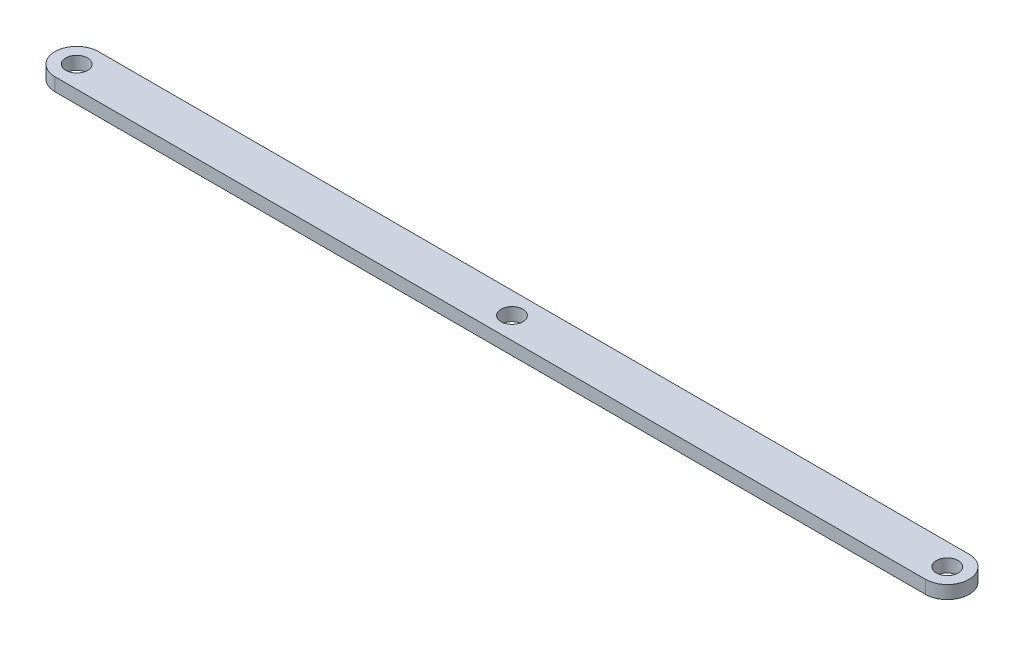
ISO-10303-21;
HEADER;
FILE_DESCRIPTION(('STEP AP214'),'2;1');
FILE_NAME('part.step','',(''),(''),'','','');
FILE_SCHEMA(('AUTOMOTIVE_DESIGN { 1 0 10303 214 1 1 1 1 }'));
ENDSEC;
DATA;
#1=APPLICATION_CONTEXT('core data for automotive mechanical design processes');
#2=APPLICATION_PROTOCOL_DEFINITION('international standard','automotive_design',2000,#1);
#3=PRODUCT_CONTEXT('',#1,'mechanical');
#4=PRODUCT('Part','Part','',(#3));
#5=PRODUCT_RELATED_PRODUCT_CATEGORY('part','',(#4));
#6=PRODUCT_DEFINITION_FORMATION('','',#4);
#7=PRODUCT_DEFINITION_CONTEXT('part definition',#1,'design');
#8=PRODUCT_DEFINITION('design','',#6,#7);
#9=PRODUCT_DEFINITION_SHAPE('','',#8);
#10=(LENGTH_UNIT() NAMED_UNIT(*) SI_UNIT(.MILLI.,.METRE.));
#11=(NAMED_UNIT(*) PLANE_ANGLE_UNIT() SI_UNIT($,.RADIAN.));
#12=(NAMED_UNIT(*) SI_UNIT($,.STERADIAN.) SOLID_ANGLE_UNIT());
#13=UNCERTAINTY_MEASURE_WITH_UNIT(LENGTH_MEASURE(1.E-05),#10,'distance_accuracy_value','');
#14=(GEOMETRIC_REPRESENTATION_CONTEXT(3) GLOBAL_UNCERTAINTY_ASSIGNED_CONTEXT((#13)) GLOBAL_UNIT_ASSIGNED_CONTEXT((#10,
#11,#12)) REPRESENTATION_CONTEXT('',''));
#15=CARTESIAN_POINT('',(0.,0.,0.));
#16=DIRECTION('',(0.,0.,1.));
#17=DIRECTION('',(1.,0.,0.));
#18=AXIS2_PLACEMENT_3D('',#15,#16,#17);
#19=CARTESIAN_POINT('',(-100.,3.,0.));
#20=DIRECTION('',(0.,-1.,0.));
#21=DIRECTION('',(0.,0.,-1.));
#22=AXIS2_PLACEMENT_3D('',#19,#20,#21);
#23=CYLINDRICAL_SURFACE('',#22,5.);
#24=CARTESIAN_POINT('',(-100.,0.,0.));
#25=DIRECTION('',(0.,1.,0.));
#26=DIRECTION('',(0.,0.,1.));
#27=AXIS2_PLACEMENT_3D('',#24,#25,#26);
#28=CIRCLE('',#27,5.);
#29=CARTESIAN_POINT('',(-100.,0.,-5.));
#30=VERTEX_POINT('',#29);
#31=CARTESIAN_POINT('',(-100.,0.,5.));
#32=VERTEX_POINT('',#31);
#33=EDGE_CURVE('E97',#30,#32,#28,.T.);
#34=ORIENTED_EDGE('',*,*,#33,.T.);
#35=DIRECTION('',(0.,-1.,0.));
#36=VECTOR('',#35,1.);
#37=CARTESIAN_POINT('',(-100.,3.,5.));
#38=LINE('',#37,#36);
#39=CARTESIAN_POINT('',(-100.,3.,5.));
#40=VERTEX_POINT('',#39);
#41=EDGE_CURVE('E11',#40,#32,#38,.T.);
#42=ORIENTED_EDGE('',*,*,#41,.F.);
#43=CARTESIAN_POINT('',(-100.,3.,0.));
#44=DIRECTION('',(0.,1.,0.));
#45=DIRECTION('',(0.,0.,1.));
#46=AXIS2_PLACEMENT_3D('',#43,#44,#45);
#47=CIRCLE('',#46,5.);
#48=CARTESIAN_POINT('',(-100.,3.,-5.));
#49=VERTEX_POINT('',#48);
#50=EDGE_CURVE('E85',#49,#40,#47,.T.);
#51=ORIENTED_EDGE('',*,*,#50,.F.);
#52=DIRECTION('',(0.,-1.,0.));
#53=VECTOR('',#52,1.);
#54=CARTESIAN_POINT('',(-100.,3.,-5.));
#55=LINE('',#54,#53);
#56=EDGE_CURVE('E93',#49,#30,#55,.T.);
#57=ORIENTED_EDGE('',*,*,#56,.T.);
#58=EDGE_LOOP('',(#34,#42,#51,#57));
#59=FACE_BOUND('',#58,.T.);
#60=ADVANCED_FACE('F34',(#59),#23,.T.);
#61=CARTESIAN_POINT('',(-100.,3.,5.));
#62=DIRECTION('',(0.,0.,-1.));
#63=DIRECTION('',(-1.,0.,0.));
#64=AXIS2_PLACEMENT_3D('',#61,#62,#63);
#65=PLANE('',#64);
#66=DIRECTION('',(1.,0.,0.));
#67=VECTOR('',#66,1.);
#68=CARTESIAN_POINT('',(-100.,0.,5.));
#69=LINE('',#68,#67);
#70=CARTESIAN_POINT('',(100.,0.,4.99999999999996));
#71=VERTEX_POINT('',#70);
#72=EDGE_CURVE('E89',#32,#71,#69,.T.);
#73=ORIENTED_EDGE('',*,*,#72,.T.);
#74=DIRECTION('',(0.,-1.,0.));
#75=VECTOR('',#74,1.);
#76=CARTESIAN_POINT('',(100.,3.,4.99999999999996));
#77=LINE('',#76,#75);
#78=CARTESIAN_POINT('',(100.,3.,4.99999999999996));
#79=VERTEX_POINT('',#78);
#80=EDGE_CURVE('E42',#79,#71,#77,.T.);
#81=ORIENTED_EDGE('',*,*,#80,.F.);
#82=DIRECTION('',(1.,0.,0.));
#83=VECTOR('',#82,1.);
#84=CARTESIAN_POINT('',(-100.,3.,5.));
#85=LINE('',#84,#83);
#86=EDGE_CURVE('E80',#40,#79,#85,.T.);
#87=ORIENTED_EDGE('',*,*,#86,.F.);
#88=ORIENTED_EDGE('',*,*,#41,.T.);
#89=EDGE_LOOP('',(#73,#81,#87,#88));
#90=FACE_BOUND('',#89,.T.);
#91=ADVANCED_FACE('F88',(#90),#65,.F.);
#92=CARTESIAN_POINT('',(100.,3.,0.));
#93=DIRECTION('',(0.,-1.,0.));
#94=DIRECTION('',(0.,0.,-1.));
#95=AXIS2_PLACEMENT_3D('',#92,#93,#94);
#96=CYLINDRICAL_SURFACE('',#95,5.);
#97=CARTESIAN_POINT('',(100.,0.,0.));
#98=DIRECTION('',(0.,1.,0.));
#99=DIRECTION('',(0.,0.,1.));
#100=AXIS2_PLACEMENT_3D('',#97,#98,#99);
#101=CIRCLE('',#100,5.);
#102=CARTESIAN_POINT('',(100.,0.,-5.00000000000004));
#103=VERTEX_POINT('',#102);
#104=EDGE_CURVE('E67',#71,#103,#101,.T.);
#105=ORIENTED_EDGE('',*,*,#104,.T.);
#106=DIRECTION('',(0.,-1.,0.));
#107=VECTOR('',#106,1.);
#108=CARTESIAN_POINT('',(100.,3.,-5.00000000000004));
#109=LINE('',#108,#107);
#110=CARTESIAN_POINT('',(100.,3.,-5.00000000000004));
#111=VERTEX_POINT('',#110);
#112=EDGE_CURVE('E90',#111,#103,#109,.T.);
#113=ORIENTED_EDGE('',*,*,#112,.F.);
#114=CARTESIAN_POINT('',(100.,3.,0.));
#115=DIRECTION('',(0.,1.,0.));
#116=DIRECTION('',(0.,0.,1.));
#117=AXIS2_PLACEMENT_3D('',#114,#115,#116);
#118=CIRCLE('',#117,5.);
#119=EDGE_CURVE('E83',#79,#111,#118,.T.);
#120=ORIENTED_EDGE('',*,*,#119,.F.);
#121=ORIENTED_EDGE('',*,*,#80,.T.);
#122=EDGE_LOOP('',(#105,#113,#120,#121));
#123=FACE_BOUND('',#122,.T.);
#124=ADVANCED_FACE('F91',(#123),#96,.T.);
#125=CARTESIAN_POINT('',(-100.,3.,-5.));
#126=DIRECTION('',(0.,0.,1.));
#127=DIRECTION('',(1.,0.,0.));
#128=AXIS2_PLACEMENT_3D('',#125,#126,#127);
#129=PLANE('',#128);
#130=DIRECTION('',(-1.,0.,0.));
#131=VECTOR('',#130,1.);
#132=CARTESIAN_POINT('',(-100.,0.,-5.));
#133=LINE('',#132,#131);
#134=EDGE_CURVE('E73',#103,#30,#133,.T.);
#135=ORIENTED_EDGE('',*,*,#134,.T.);
#136=ORIENTED_EDGE('',*,*,#56,.F.);
#137=DIRECTION('',(-1.,0.,0.));
#138=VECTOR('',#137,1.);
#139=CARTESIAN_POINT('',(-100.,3.,-5.));
#140=LINE('',#139,#138);
#141=EDGE_CURVE('E50',#111,#49,#140,.T.);
#142=ORIENTED_EDGE('',*,*,#141,.F.);
#143=ORIENTED_EDGE('',*,*,#112,.T.);
#144=EDGE_LOOP('',(#135,#136,#142,#143));
#145=FACE_BOUND('',#144,.T.);
#146=ADVANCED_FACE('F105',(#145),#129,.F.);
#147=CARTESIAN_POINT('',(-100.,3.,0.));
#148=DIRECTION('',(0.,1.,0.));
#149=DIRECTION('',(0.,0.,1.));
#150=AXIS2_PLACEMENT_3D('',#147,#148,#149);
#151=PLANE('',#150);
#152=CARTESIAN_POINT('',(0.,3.,0.));
#153=DIRECTION('',(0.,1.,0.));
#154=DIRECTION('',(0.,0.,1.));
#155=AXIS2_PLACEMENT_3D('',#152,#153,#154);
#156=CIRCLE('',#155,2.5);
#157=CARTESIAN_POINT('',(0.,3.,-2.5));
#158=VERTEX_POINT('',#157);
#159=EDGE_CURVE('E123',#158,#158,#156,.F.);
#160=ORIENTED_EDGE('',*,*,#159,.T.);
#161=EDGE_LOOP('',(#160));
#162=FACE_BOUND('',#161,.T.);
#163=CARTESIAN_POINT('',(-100.,3.,0.));
#164=DIRECTION('',(0.,-1.,0.));
#165=DIRECTION('',(0.,0.,1.));
#166=AXIS2_PLACEMENT_3D('',#163,#164,#165);
#167=CIRCLE('',#166,2.5);
#168=CARTESIAN_POINT('',(-100.,3.,2.49999999999996));
#169=VERTEX_POINT('',#168);
#170=EDGE_CURVE('E116',#169,#169,#167,.T.);
#171=ORIENTED_EDGE('',*,*,#170,.T.);
#172=EDGE_LOOP('',(#171));
#173=FACE_BOUND('',#172,.T.);
#174=CARTESIAN_POINT('',(100.,3.,0.));
#175=DIRECTION('',(0.,1.,0.));
#176=DIRECTION('',(0.,0.,1.));
#177=AXIS2_PLACEMENT_3D('',#174,#175,#176);
#178=CIRCLE('',#177,2.5);
#179=CARTESIAN_POINT('',(100.,3.,2.49999999999996));
#180=VERTEX_POINT('',#179);
#181=EDGE_CURVE('E113',#180,#180,#178,.T.);
#182=ORIENTED_EDGE('',*,*,#181,.F.);
#183=EDGE_LOOP('',(#182));
#184=FACE_BOUND('',#183,.T.);
#185=ORIENTED_EDGE('',*,*,#50,.T.);
#186=ORIENTED_EDGE('',*,*,#86,.T.);
#187=ORIENTED_EDGE('',*,*,#119,.T.);
#188=ORIENTED_EDGE('',*,*,#141,.T.);
#189=EDGE_LOOP('',(#185,#186,#187,#188));
#190=FACE_BOUND('',#189,.T.);
#191=ADVANCED_FACE('F81',(#162,#173,#184,#190),#151,.T.);
#192=CARTESIAN_POINT('',(-100.,0.,0.));
#193=DIRECTION('',(0.,1.,0.));
#194=DIRECTION('',(0.,0.,1.));
#195=AXIS2_PLACEMENT_3D('',#192,#193,#194);
#196=PLANE('',#195);
#197=CARTESIAN_POINT('',(0.,0.,0.));
#198=DIRECTION('',(0.,-1.,0.));
#199=DIRECTION('',(0.,0.,-1.));
#200=AXIS2_PLACEMENT_3D('',#197,#198,#199);
#201=CIRCLE('',#200,2.5);
#202=CARTESIAN_POINT('',(0.,0.,-2.5));
#203=VERTEX_POINT('',#202);
#204=EDGE_CURVE('E120',#203,#203,#201,.T.);
#205=ORIENTED_EDGE('',*,*,#204,.F.);
#206=EDGE_LOOP('',(#205));
#207=FACE_BOUND('',#206,.T.);
#208=CARTESIAN_POINT('',(-100.,0.,0.));
#209=DIRECTION('',(0.,1.,0.));
#210=DIRECTION('',(0.,0.,1.));
#211=AXIS2_PLACEMENT_3D('',#208,#209,#210);
#212=CIRCLE('',#211,2.5);
#213=CARTESIAN_POINT('',(-100.,0.,2.49999999999996));
#214=VERTEX_POINT('',#213);
#215=EDGE_CURVE('E117',#214,#214,#212,.T.);
#216=ORIENTED_EDGE('',*,*,#215,.T.);
#217=EDGE_LOOP('',(#216));
#218=FACE_BOUND('',#217,.T.);
#219=CARTESIAN_POINT('',(100.,0.,0.));
#220=DIRECTION('',(0.,1.,0.));
#221=DIRECTION('',(0.,0.,1.));
#222=AXIS2_PLACEMENT_3D('',#219,#220,#221);
#223=CIRCLE('',#222,2.5);
#224=CARTESIAN_POINT('',(100.,0.,2.49999999999996));
#225=VERTEX_POINT('',#224);
#226=EDGE_CURVE('E100',#225,#225,#223,.F.);
#227=ORIENTED_EDGE('',*,*,#226,.F.);
#228=EDGE_LOOP('',(#227));
#229=FACE_BOUND('',#228,.T.);
#230=ORIENTED_EDGE('',*,*,#33,.F.);
#231=ORIENTED_EDGE('',*,*,#134,.F.);
#232=ORIENTED_EDGE('',*,*,#104,.F.);
#233=ORIENTED_EDGE('',*,*,#72,.F.);
#234=EDGE_LOOP('',(#230,#231,#232,#233));
#235=FACE_BOUND('',#234,.T.);
#236=ADVANCED_FACE('F108',(#207,#218,#229,#235),#196,.F.);
#237=CARTESIAN_POINT('',(100.,-0.00100000000000013,0.));
#238=DIRECTION('',(0.,1.,0.));
#239=DIRECTION('',(0.,0.,1.));
#240=AXIS2_PLACEMENT_3D('',#237,#238,#239);
#241=CYLINDRICAL_SURFACE('',#240,2.5);
#242=CARTESIAN_POINT('',(100.,3.,2.49999999999996));
#243=CARTESIAN_POINT('',(100.,2.96875,2.49999999999996));
#244=CARTESIAN_POINT('',(100.,2.9375,2.49999999999996));
#245=CARTESIAN_POINT('',(100.,2.875,2.49999999999996));
#246=CARTESIAN_POINT('',(100.,2.84375,2.49999999999996));
#247=CARTESIAN_POINT('',(100.,2.78125,2.49999999999996));
#248=CARTESIAN_POINT('',(100.,2.75,2.49999999999996));
#249=CARTESIAN_POINT('',(100.,2.6875,2.49999999999996));
#250=CARTESIAN_POINT('',(100.,2.65625,2.49999999999996));
#251=CARTESIAN_POINT('',(100.,2.59375,2.49999999999996));
#252=CARTESIAN_POINT('',(100.,2.5625,2.49999999999996));
#253=CARTESIAN_POINT('',(100.,2.5,2.49999999999996));
#254=CARTESIAN_POINT('',(100.,2.46875,2.49999999999996));
#255=CARTESIAN_POINT('',(100.,2.40625,2.49999999999996));
#256=CARTESIAN_POINT('',(100.,2.375,2.49999999999996));
#257=CARTESIAN_POINT('',(100.,2.3125,2.49999999999996));
#258=CARTESIAN_POINT('',(100.,2.28125,2.49999999999996));
#259=CARTESIAN_POINT('',(100.,2.21875,2.49999999999996));
#260=CARTESIAN_POINT('',(100.,2.1875,2.49999999999996));
#261=CARTESIAN_POINT('',(100.,2.125,2.49999999999996));
#262=CARTESIAN_POINT('',(100.,2.09375,2.49999999999996));
#263=CARTESIAN_POINT('',(100.,2.03125,2.49999999999996));
#264=CARTESIAN_POINT('',(100.,2.,2.49999999999996));
#265=CARTESIAN_POINT('',(100.,1.9375,2.49999999999996));
#266=CARTESIAN_POINT('',(100.,1.90625,2.49999999999996));
#267=CARTESIAN_POINT('',(100.,1.84375,2.49999999999996));
#268=CARTESIAN_POINT('',(100.,1.8125,2.49999999999996));
#269=CARTESIAN_POINT('',(100.,1.75,2.49999999999996));
#270=CARTESIAN_POINT('',(100.,1.71875,2.49999999999996));
#271=CARTESIAN_POINT('',(100.,1.65625,2.49999999999996));
#272=CARTESIAN_POINT('',(100.,1.625,2.49999999999996));
#273=CARTESIAN_POINT('',(100.,1.5625,2.49999999999996));
#274=CARTESIAN_POINT('',(100.,1.53125,2.49999999999996));
#275=CARTESIAN_POINT('',(100.,1.46875,2.49999999999996));
#276=CARTESIAN_POINT('',(100.,1.4375,2.49999999999996));
#277=CARTESIAN_POINT('',(100.,1.375,2.49999999999996));
#278=CARTESIAN_POINT('',(100.,1.34375,2.49999999999996));
#279=CARTESIAN_POINT('',(100.,1.28125,2.49999999999996));
#280=CARTESIAN_POINT('',(100.,1.25,2.49999999999996));
#281=CARTESIAN_POINT('',(100.,1.1875,2.49999999999996));
#282=CARTESIAN_POINT('',(100.,1.15625,2.49999999999996));
#283=CARTESIAN_POINT('',(100.,1.09375,2.49999999999996));
#284=CARTESIAN_POINT('',(100.,1.0625,2.49999999999996));
#285=CARTESIAN_POINT('',(100.,1.,2.49999999999996));
#286=CARTESIAN_POINT('',(100.,0.96875,2.49999999999996));
#287=CARTESIAN_POINT('',(100.,0.90625,2.49999999999996));
#288=CARTESIAN_POINT('',(100.,0.875,2.49999999999996));
#289=CARTESIAN_POINT('',(100.,0.8125,2.49999999999996));
#290=CARTESIAN_POINT('',(100.,0.78125,2.49999999999996));
#291=CARTESIAN_POINT('',(100.,0.71875,2.49999999999996));
#292=CARTESIAN_POINT('',(100.,0.6875,2.49999999999996));
#293=CARTESIAN_POINT('',(100.,0.625,2.49999999999996));
#294=CARTESIAN_POINT('',(100.,0.59375,2.49999999999996));
#295=CARTESIAN_POINT('',(100.,0.53125,2.49999999999996));
#296=CARTESIAN_POINT('',(100.,0.5,2.49999999999996));
#297=CARTESIAN_POINT('',(100.,0.4375,2.49999999999996));
#298=CARTESIAN_POINT('',(100.,0.40625,2.49999999999996));
#299=CARTESIAN_POINT('',(100.,0.34375,2.49999999999996));
#300=CARTESIAN_POINT('',(100.,0.3125,2.49999999999996));
#301=CARTESIAN_POINT('',(100.,0.25,2.49999999999996));
#302=CARTESIAN_POINT('',(100.,0.21875,2.49999999999996));
#303=CARTESIAN_POINT('',(100.,0.15625,2.49999999999996));
#304=CARTESIAN_POINT('',(100.,0.125,2.49999999999996));
#305=CARTESIAN_POINT('',(100.,0.0625000000000001,2.49999999999996));
#306=CARTESIAN_POINT('',(100.,0.0312500000000001,2.49999999999996));
#307=CARTESIAN_POINT('',(100.,0.,2.49999999999996));
#308=B_SPLINE_CURVE_WITH_KNOTS('',3,(#242,#243,#244,#245,#246,#247,#248,#249,#250,#251,#252,
#253,#254,#255,#256,#257,#258,#259,#260,#261,#262,#263,#264,#265,#266,#267,#268,#269,#270,#271,
#272,#273,#274,#275,#276,#277,#278,#279,#280,#281,#282,#283,#284,#285,#286,#287,#288,#289,#290,
#291,#292,#293,#294,#295,#296,#297,#298,#299,#300,#301,#302,#303,#304,#305,#306,#307),
.UNSPECIFIED.,.F.,.F.,(4,2,2,2,2,2,2,2,2,2,2,2,2,2,2,2,2,2,2,2,2,2,2,2,2,2,2,2,2,2,2,2,4),(0.,
0.0937500000000001,0.1875,0.28125,0.375,0.46875,0.5625,0.65625,0.75,0.84375,0.9375,1.03125,
1.125,1.21875,1.3125,1.40625,1.5,1.59375,1.6875,1.78125,1.875,1.96875,2.0625,2.15625,2.25,
2.34375,2.4375,2.53125,2.625,2.71875,2.8125,2.90625,3.),.UNSPECIFIED.);
#309=EDGE_CURVE('BSEAM133',#180,#225,#308,.T.);
#310=ORIENTED_EDGE('',*,*,#181,.T.);
#311=ORIENTED_EDGE('',*,*,#226,.T.);
#312=ORIENTED_EDGE('',*,*,#309,.T.);
#313=ORIENTED_EDGE('',*,*,#309,.F.);
#314=EDGE_LOOP('',(#310,#312,#311,#313));
#315=FACE_BOUND('',#314,.T.);
#316=ADVANCED_FACE('F133',(#315),#241,.F.);
#317=CARTESIAN_POINT('',(-100.,-0.00100000000000013,0.));
#318=DIRECTION('',(0.,1.,0.));
#319=DIRECTION('',(0.,0.,1.));
#320=AXIS2_PLACEMENT_3D('',#317,#318,#319);
#321=CYLINDRICAL_SURFACE('',#320,2.5);
#322=CARTESIAN_POINT('',(-100.,3.,2.49999999999996));
#323=CARTESIAN_POINT('',(-100.,2.96875,2.49999999999996));
#324=CARTESIAN_POINT('',(-100.,2.9375,2.49999999999996));
#325=CARTESIAN_POINT('',(-100.,2.875,2.49999999999996));
#326=CARTESIAN_POINT('',(-100.,2.84375,2.49999999999996));
#327=CARTESIAN_POINT('',(-100.,2.78125,2.49999999999996));
#328=CARTESIAN_POINT('',(-100.,2.75,2.49999999999996));
#329=CARTESIAN_POINT('',(-100.,2.6875,2.49999999999996));
#330=CARTESIAN_POINT('',(-100.,2.65625,2.49999999999996));
#331=CARTESIAN_POINT('',(-100.,2.59375,2.49999999999996));
#332=CARTESIAN_POINT('',(-100.,2.5625,2.49999999999996));
#333=CARTESIAN_POINT('',(-100.,2.5,2.49999999999996));
#334=CARTESIAN_POINT('',(-100.,2.46875,2.49999999999996));
#335=CARTESIAN_POINT('',(-100.,2.40625,2.49999999999996));
#336=CARTESIAN_POINT('',(-100.,2.375,2.49999999999996));
#337=CARTESIAN_POINT('',(-100.,2.3125,2.49999999999996));
#338=CARTESIAN_POINT('',(-100.,2.28125,2.49999999999996));
#339=CARTESIAN_POINT('',(-100.,2.21875,2.49999999999996));
#340=CARTESIAN_POINT('',(-100.,2.1875,2.49999999999996));
#341=CARTESIAN_POINT('',(-100.,2.125,2.49999999999996));
#342=CARTESIAN_POINT('',(-100.,2.09375,2.49999999999996));
#343=CARTESIAN_POINT('',(-100.,2.03125,2.49999999999996));
#344=CARTESIAN_POINT('',(-100.,2.,2.49999999999996));
#345=CARTESIAN_POINT('',(-100.,1.9375,2.49999999999996));
#346=CARTESIAN_POINT('',(-100.,1.90625,2.49999999999996));
#347=CARTESIAN_POINT('',(-100.,1.84375,2.49999999999996));
#348=CARTESIAN_POINT('',(-100.,1.8125,2.49999999999996));
#349=CARTESIAN_POINT('',(-100.,1.75,2.49999999999996));
#350=CARTESIAN_POINT('',(-100.,1.71875,2.49999999999996));
#351=CARTESIAN_POINT('',(-100.,1.65625,2.49999999999996));
#352=CARTESIAN_POINT('',(-100.,1.625,2.49999999999996));
#353=CARTESIAN_POINT('',(-100.,1.5625,2.49999999999996));
#354=CARTESIAN_POINT('',(-100.,1.53125,2.49999999999996));
#355=CARTESIAN_POINT('',(-100.,1.46875,2.49999999999996));
#356=CARTESIAN_POINT('',(-100.,1.4375,2.49999999999996));
#357=CARTESIAN_POINT('',(-100.,1.375,2.49999999999996));
#358=CARTESIAN_POINT('',(-100.,1.34375,2.49999999999996));
#359=CARTESIAN_POINT('',(-100.,1.28125,2.49999999999996));
#360=CARTESIAN_POINT('',(-100.,1.25,2.49999999999996));
#361=CARTESIAN_POINT('',(-100.,1.1875,2.49999999999996));
#362=CARTESIAN_POINT('',(-100.,1.15625,2.49999999999996));
#363=CARTESIAN_POINT('',(-100.,1.09375,2.49999999999996));
#364=CARTESIAN_POINT('',(-100.,1.0625,2.49999999999996));
#365=CARTESIAN_POINT('',(-100.,1.,2.49999999999996));
#366=CARTESIAN_POINT('',(-100.,0.96875,2.49999999999996));
#367=CARTESIAN_POINT('',(-100.,0.90625,2.49999999999996));
#368=CARTESIAN_POINT('',(-100.,0.875,2.49999999999996));
#369=CARTESIAN_POINT('',(-100.,0.8125,2.49999999999996));
#370=CARTESIAN_POINT('',(-100.,0.78125,2.49999999999996));
#371=CARTESIAN_POINT('',(-100.,0.71875,2.49999999999996));
#372=CARTESIAN_POINT('',(-100.,0.6875,2.49999999999996));
#373=CARTESIAN_POINT('',(-100.,0.625,2.49999999999996));
#374=CARTESIAN_POINT('',(-100.,0.59375,2.49999999999996));
#375=CARTESIAN_POINT('',(-100.,0.53125,2.49999999999996));
#376=CARTESIAN_POINT('',(-100.,0.5,2.49999999999996));
#377=CARTESIAN_POINT('',(-100.,0.4375,2.49999999999996));
#378=CARTESIAN_POINT('',(-100.,0.40625,2.49999999999996));
#379=CARTESIAN_POINT('',(-100.,0.34375,2.49999999999996));
#380=CARTESIAN_POINT('',(-100.,0.3125,2.49999999999996));
#381=CARTESIAN_POINT('',(-100.,0.25,2.49999999999996));
#382=CARTESIAN_POINT('',(-100.,0.21875,2.49999999999996));
#383=CARTESIAN_POINT('',(-100.,0.15625,2.49999999999996));
#384=CARTESIAN_POINT('',(-100.,0.125,2.49999999999996));
#385=CARTESIAN_POINT('',(-100.,0.0625000000000001,2.49999999999996));
#386=CARTESIAN_POINT('',(-100.,0.03125,2.49999999999996));
#387=CARTESIAN_POINT('',(-100.,0.,2.49999999999996));
#388=B_SPLINE_CURVE_WITH_KNOTS('',3,(#322,#323,#324,#325,#326,#327,#328,#329,#330,#331,#332,
#333,#334,#335,#336,#337,#338,#339,#340,#341,#342,#343,#344,#345,#346,#347,#348,#349,#350,#351,
#352,#353,#354,#355,#356,#357,#358,#359,#360,#361,#362,#363,#364,#365,#366,#367,#368,#369,#370,
#371,#372,#373,#374,#375,#376,#377,#378,#379,#380,#381,#382,#383,#384,#385,#386,#387),
.UNSPECIFIED.,.F.,.F.,(4,2,2,2,2,2,2,2,2,2,2,2,2,2,2,2,2,2,2,2,2,2,2,2,2,2,2,2,2,2,2,2,4),(0.,
0.0937500000000001,0.1875,0.28125,0.375,0.46875,0.5625,0.65625,0.75,0.84375,0.9375,1.03125,
1.125,1.21875,1.3125,1.40625,1.5,1.59375,1.6875,1.78125,1.875,1.96875,2.0625,2.15625,2.25,
2.34375,2.4375,2.53125,2.625,2.71875,2.8125,2.90625,3.),.UNSPECIFIED.);
#389=EDGE_CURVE('BSEAM140',#169,#214,#388,.T.);
#390=ORIENTED_EDGE('',*,*,#170,.F.);
#391=ORIENTED_EDGE('',*,*,#215,.F.);
#392=ORIENTED_EDGE('',*,*,#389,.T.);
#393=ORIENTED_EDGE('',*,*,#389,.F.);
#394=EDGE_LOOP('',(#390,#392,#391,#393));
#395=FACE_BOUND('',#394,.T.);
#396=ADVANCED_FACE('F140',(#395),#321,.F.);
#397=CARTESIAN_POINT('',(0.,3.001,0.));
#398=DIRECTION('',(0.,-1.,0.));
#399=DIRECTION('',(0.,0.,-1.));
#400=AXIS2_PLACEMENT_3D('',#397,#398,#399);
#401=CYLINDRICAL_SURFACE('',#400,2.5);
#402=CARTESIAN_POINT('',(0.,3.,-2.5));
#403=CARTESIAN_POINT('',(0.,2.96875,-2.5));
#404=CARTESIAN_POINT('',(0.,2.9375,-2.5));
#405=CARTESIAN_POINT('',(0.,2.875,-2.5));
#406=CARTESIAN_POINT('',(0.,2.84375,-2.5));
#407=CARTESIAN_POINT('',(0.,2.78125,-2.5));
#408=CARTESIAN_POINT('',(0.,2.75,-2.5));
#409=CARTESIAN_POINT('',(0.,2.6875,-2.5));
#410=CARTESIAN_POINT('',(0.,2.65625,-2.5));
#411=CARTESIAN_POINT('',(0.,2.59375,-2.5));
#412=CARTESIAN_POINT('',(0.,2.5625,-2.5));
#413=CARTESIAN_POINT('',(0.,2.5,-2.5));
#414=CARTESIAN_POINT('',(0.,2.46875,-2.5));
#415=CARTESIAN_POINT('',(0.,2.40625,-2.5));
#416=CARTESIAN_POINT('',(0.,2.375,-2.5));
#417=CARTESIAN_POINT('',(0.,2.3125,-2.5));
#418=CARTESIAN_POINT('',(0.,2.28125,-2.5));
#419=CARTESIAN_POINT('',(0.,2.21875,-2.5));
#420=CARTESIAN_POINT('',(0.,2.1875,-2.5));
#421=CARTESIAN_POINT('',(0.,2.125,-2.5));
#422=CARTESIAN_POINT('',(0.,2.09375,-2.5));
#423=CARTESIAN_POINT('',(0.,2.03125,-2.5));
#424=CARTESIAN_POINT('',(0.,2.,-2.5));
#425=CARTESIAN_POINT('',(0.,1.9375,-2.5));
#426=CARTESIAN_POINT('',(0.,1.90625,-2.5));
#427=CARTESIAN_POINT('',(0.,1.84375,-2.5));
#428=CARTESIAN_POINT('',(0.,1.8125,-2.5));
#429=CARTESIAN_POINT('',(0.,1.75,-2.5));
#430=CARTESIAN_POINT('',(0.,1.71875,-2.5));
#431=CARTESIAN_POINT('',(0.,1.65625,-2.5));
#432=CARTESIAN_POINT('',(0.,1.625,-2.5));
#433=CARTESIAN_POINT('',(0.,1.5625,-2.5));
#434=CARTESIAN_POINT('',(0.,1.53125,-2.5));
#435=CARTESIAN_POINT('',(0.,1.46875,-2.5));
#436=CARTESIAN_POINT('',(0.,1.4375,-2.5));
#437=CARTESIAN_POINT('',(0.,1.375,-2.5));
#438=CARTESIAN_POINT('',(0.,1.34375,-2.5));
#439=CARTESIAN_POINT('',(0.,1.28125,-2.5));
#440=CARTESIAN_POINT('',(0.,1.25,-2.5));
#441=CARTESIAN_POINT('',(0.,1.1875,-2.5));
#442=CARTESIAN_POINT('',(0.,1.15625,-2.5));
#443=CARTESIAN_POINT('',(0.,1.09375,-2.5));
#444=CARTESIAN_POINT('',(0.,1.0625,-2.5));
#445=CARTESIAN_POINT('',(0.,1.,-2.5));
#446=CARTESIAN_POINT('',(0.,0.96875,-2.5));
#447=CARTESIAN_POINT('',(0.,0.90625,-2.5));
#448=CARTESIAN_POINT('',(0.,0.875,-2.5));
#449=CARTESIAN_POINT('',(0.,0.8125,-2.5));
#450=CARTESIAN_POINT('',(0.,0.78125,-2.5));
#451=CARTESIAN_POINT('',(0.,0.71875,-2.5));
#452=CARTESIAN_POINT('',(0.,0.6875,-2.5));
#453=CARTESIAN_POINT('',(0.,0.625,-2.5));
#454=CARTESIAN_POINT('',(0.,0.59375,-2.5));
#455=CARTESIAN_POINT('',(0.,0.53125,-2.5));
#456=CARTESIAN_POINT('',(0.,0.5,-2.5));
#457=CARTESIAN_POINT('',(0.,0.4375,-2.5));
#458=CARTESIAN_POINT('',(0.,0.40625,-2.5));
#459=CARTESIAN_POINT('',(0.,0.34375,-2.5));
#460=CARTESIAN_POINT('',(0.,0.3125,-2.5));
#461=CARTESIAN_POINT('',(0.,0.25,-2.5));
#462=CARTESIAN_POINT('',(0.,0.21875,-2.5));
#463=CARTESIAN_POINT('',(0.,0.156250000000001,-2.5));
#464=CARTESIAN_POINT('',(0.,0.125000000000001,-2.5));
#465=CARTESIAN_POINT('',(0.,0.0625000000000005,-2.5));
#466=CARTESIAN_POINT('',(0.,0.0312500000000005,-2.5));
#467=CARTESIAN_POINT('',(0.,0.,-2.5));
#468=B_SPLINE_CURVE_WITH_KNOTS('',3,(#402,#403,#404,#405,#406,#407,#408,#409,#410,#411,#412,
#413,#414,#415,#416,#417,#418,#419,#420,#421,#422,#423,#424,#425,#426,#427,#428,#429,#430,#431,
#432,#433,#434,#435,#436,#437,#438,#439,#440,#441,#442,#443,#444,#445,#446,#447,#448,#449,#450,
#451,#452,#453,#454,#455,#456,#457,#458,#459,#460,#461,#462,#463,#464,#465,#466,#467),
.UNSPECIFIED.,.F.,.F.,(4,2,2,2,2,2,2,2,2,2,2,2,2,2,2,2,2,2,2,2,2,2,2,2,2,2,2,2,2,2,2,2,4),(0.,
0.0937499999999997,0.1875,0.28125,0.375,0.46875,0.5625,0.65625,0.749999999999999,
0.843749999999999,0.9375,1.03125,1.125,1.21875,1.3125,1.40625,1.5,1.59375,1.6875,1.78125,1.875,
1.96875,2.0625,2.15625,2.25,2.34375,2.4375,2.53125,2.625,2.71875,2.8125,2.90625,3.),.UNSPECIFIED.);
#469=EDGE_CURVE('BSEAM129',#158,#203,#468,.T.);
#470=ORIENTED_EDGE('',*,*,#159,.F.);
#471=ORIENTED_EDGE('',*,*,#204,.T.);
#472=ORIENTED_EDGE('',*,*,#469,.T.);
#473=ORIENTED_EDGE('',*,*,#469,.F.);
#474=EDGE_LOOP('',(#470,#472,#471,#473));
#475=FACE_BOUND('',#474,.T.);
#476=ADVANCED_FACE('F129',(#475),#401,.F.);
#477=CLOSED_SHELL('',(#60,#91,#124,#146,#191,#236,#316,#396,#476));
#478=MANIFOLD_SOLID_BREP('B2',#477);
#479=ADVANCED_BREP_SHAPE_REPRESENTATION('',(#18,#478),#14);
#480=SHAPE_DEFINITION_REPRESENTATION(#9,#479);
ENDSEC;
END-ISO-10303-21;
